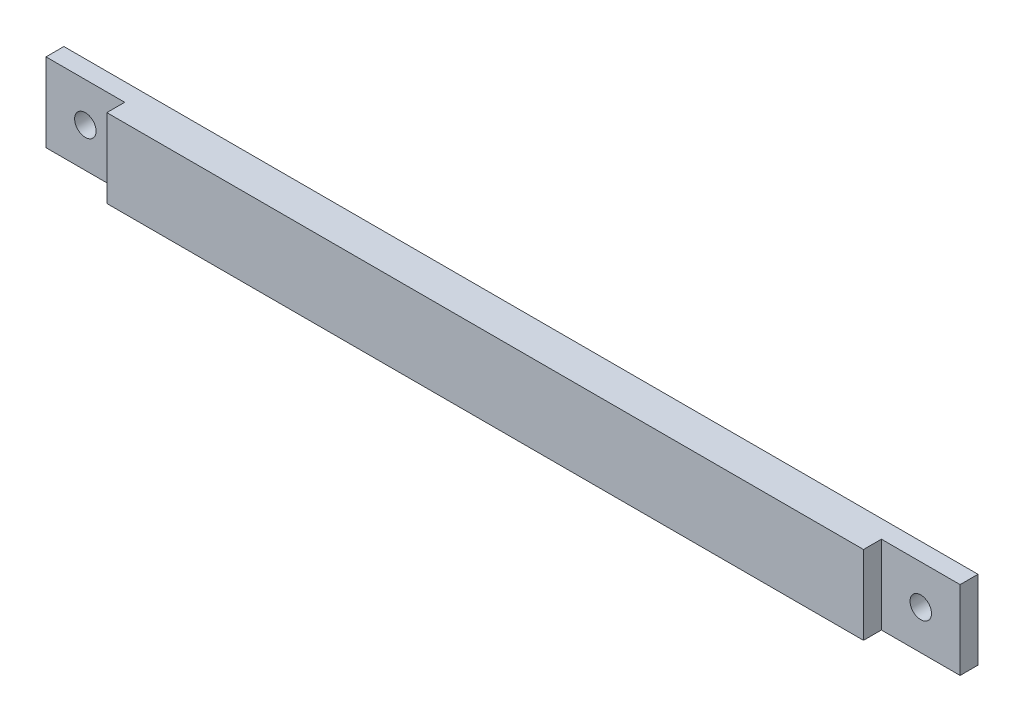
ISO-10303-21;
HEADER;
FILE_DESCRIPTION(('STEP AP214'),'2;1');
FILE_NAME('part.step','',(''),(''),'','','');
FILE_SCHEMA(('AUTOMOTIVE_DESIGN { 1 0 10303 214 1 1 1 1 }'));
ENDSEC;
DATA;
#1=APPLICATION_CONTEXT('core data for automotive mechanical design processes');
#2=APPLICATION_PROTOCOL_DEFINITION('international standard','automotive_design',2000,#1);
#3=PRODUCT_CONTEXT('',#1,'mechanical');
#4=PRODUCT('Part','Part','',(#3));
#5=PRODUCT_RELATED_PRODUCT_CATEGORY('part','',(#4));
#6=PRODUCT_DEFINITION_FORMATION('','',#4);
#7=PRODUCT_DEFINITION_CONTEXT('part definition',#1,'design');
#8=PRODUCT_DEFINITION('design','',#6,#7);
#9=PRODUCT_DEFINITION_SHAPE('','',#8);
#10=(LENGTH_UNIT() NAMED_UNIT(*) SI_UNIT(.MILLI.,.METRE.));
#11=(NAMED_UNIT(*) PLANE_ANGLE_UNIT() SI_UNIT($,.RADIAN.));
#12=(NAMED_UNIT(*) SI_UNIT($,.STERADIAN.) SOLID_ANGLE_UNIT());
#13=UNCERTAINTY_MEASURE_WITH_UNIT(LENGTH_MEASURE(1.E-05),#10,'distance_accuracy_value','');
#14=(GEOMETRIC_REPRESENTATION_CONTEXT(3) GLOBAL_UNCERTAINTY_ASSIGNED_CONTEXT((#13)) GLOBAL_UNIT_ASSIGNED_CONTEXT((#10,
#11,#12)) REPRESENTATION_CONTEXT('',''));
#15=CARTESIAN_POINT('',(0.,0.,0.));
#16=DIRECTION('',(0.,0.,1.));
#17=DIRECTION('',(1.,0.,0.));
#18=AXIS2_PLACEMENT_3D('',#15,#16,#17);
#19=CARTESIAN_POINT('',(-138.722028198163,53.8888888888889,10.));
#20=DIRECTION('',(1.,0.,0.));
#21=DIRECTION('',(0.,0.,-1.));
#22=AXIS2_PLACEMENT_3D('',#19,#20,#21);
#23=PLANE('',#22);
#24=DIRECTION('',(0.,-1.,0.));
#25=VECTOR('',#24,1.);
#26=CARTESIAN_POINT('',(-138.722028198163,53.8888888888889,5.));
#27=LINE('',#26,#25);
#28=CARTESIAN_POINT('',(-138.722028198163,53.8888888888889,5.));
#29=VERTEX_POINT('',#28);
#30=CARTESIAN_POINT('',(-138.722028198163,31.8888888888889,5.));
#31=VERTEX_POINT('',#30);
#32=EDGE_CURVE('E110',#29,#31,#27,.T.);
#33=ORIENTED_EDGE('',*,*,#32,.F.);
#34=DIRECTION('',(0.,0.,-1.));
#35=VECTOR('',#34,1.);
#36=CARTESIAN_POINT('',(-138.722028198163,53.8888888888889,10.));
#37=LINE('',#36,#35);
#38=CARTESIAN_POINT('',(-138.722028198163,53.8888888888889,0.));
#39=VERTEX_POINT('',#38);
#40=EDGE_CURVE('E134',#29,#39,#37,.T.);
#41=ORIENTED_EDGE('',*,*,#40,.T.);
#42=DIRECTION('',(0.,-1.,0.));
#43=VECTOR('',#42,1.);
#44=CARTESIAN_POINT('',(-138.722028198163,53.8888888888889,0.));
#45=LINE('',#44,#43);
#46=CARTESIAN_POINT('',(-138.722028198163,31.8888888888889,0.));
#47=VERTEX_POINT('',#46);
#48=EDGE_CURVE('E133',#39,#47,#45,.T.);
#49=ORIENTED_EDGE('',*,*,#48,.T.);
#50=DIRECTION('',(0.,0.,-1.));
#51=VECTOR('',#50,1.);
#52=CARTESIAN_POINT('',(-138.722028198163,31.8888888888889,10.));
#53=LINE('',#52,#51);
#54=EDGE_CURVE('E11',#31,#47,#53,.T.);
#55=ORIENTED_EDGE('',*,*,#54,.F.);
#56=EDGE_LOOP('',(#33,#41,#49,#55));
#57=FACE_BOUND('',#56,.T.);
#58=ADVANCED_FACE('F45',(#57),#23,.F.);
#59=CARTESIAN_POINT('',(-127.722028198163,42.8888888888889,10.));
#60=DIRECTION('',(0.,0.,-1.));
#61=DIRECTION('',(-1.,0.,0.));
#62=AXIS2_PLACEMENT_3D('',#59,#60,#61);
#63=CYLINDRICAL_SURFACE('',#62,3.00000000000001);
#64=CARTESIAN_POINT('',(-127.722028198163,42.8888888888889,0.));
#65=DIRECTION('',(0.,0.,1.));
#66=DIRECTION('',(1.,0.,0.));
#67=AXIS2_PLACEMENT_3D('',#64,#65,#66);
#68=CIRCLE('',#67,3.00000000000001);
#69=CARTESIAN_POINT('',(-124.722028198163,42.8888888888889,0.));
#70=VERTEX_POINT('',#69);
#71=EDGE_CURVE('E140',#70,#70,#68,.T.);
#72=ORIENTED_EDGE('',*,*,#71,.F.);
#73=EDGE_LOOP('',(#72));
#74=FACE_BOUND('',#73,.T.);
#75=CARTESIAN_POINT('',(-127.722028198163,42.8888888888889,5.));
#76=DIRECTION('',(0.,0.,1.));
#77=DIRECTION('',(1.,0.,0.));
#78=AXIS2_PLACEMENT_3D('',#75,#76,#77);
#79=CIRCLE('',#78,3.00000000000001);
#80=CARTESIAN_POINT('',(-124.722028198163,42.8888888888889,5.));
#81=VERTEX_POINT('',#80);
#82=EDGE_CURVE('E48',#81,#81,#79,.T.);
#83=ORIENTED_EDGE('',*,*,#82,.T.);
#84=EDGE_LOOP('',(#83));
#85=FACE_BOUND('',#84,.T.);
#86=ADVANCED_FACE('F236',(#74,#85),#63,.F.);
#87=CARTESIAN_POINT('',(0.,0.,10.));
#88=DIRECTION('',(0.,0.,1.));
#89=DIRECTION('',(1.,0.,0.));
#90=AXIS2_PLACEMENT_3D('',#87,#88,#89);
#91=PLANE('',#90);
#92=DIRECTION('',(0.,1.,0.));
#93=VECTOR('',#92,1.);
#94=CARTESIAN_POINT('',(-116.722028198163,53.8888888888889,10.));
#95=LINE('',#94,#93);
#96=CARTESIAN_POINT('',(-116.722028198163,31.8888888888889,10.));
#97=VERTEX_POINT('',#96);
#98=CARTESIAN_POINT('',(-116.722028198163,53.8888888888889,10.));
#99=VERTEX_POINT('',#98);
#100=EDGE_CURVE('E121',#97,#99,#95,.T.);
#101=ORIENTED_EDGE('',*,*,#100,.F.);
#102=DIRECTION('',(1.,0.,0.));
#103=VECTOR('',#102,1.);
#104=CARTESIAN_POINT('',(-138.722028198163,31.8888888888889,10.));
#105=LINE('',#104,#103);
#106=CARTESIAN_POINT('',(94.7679718018368,31.8888888888889,10.));
#107=VERTEX_POINT('',#106);
#108=EDGE_CURVE('E159',#97,#107,#105,.T.);
#109=ORIENTED_EDGE('',*,*,#108,.T.);
#110=DIRECTION('',(0.,-1.,0.));
#111=VECTOR('',#110,1.);
#112=CARTESIAN_POINT('',(94.7679718018368,53.8888888888889,10.));
#113=LINE('',#112,#111);
#114=CARTESIAN_POINT('',(94.7679718018368,53.8888888888889,10.));
#115=VERTEX_POINT('',#114);
#116=EDGE_CURVE('E193',#115,#107,#113,.T.);
#117=ORIENTED_EDGE('',*,*,#116,.F.);
#118=DIRECTION('',(-1.,0.,0.));
#119=VECTOR('',#118,1.);
#120=CARTESIAN_POINT('',(-138.722028198163,53.8888888888889,10.));
#121=LINE('',#120,#119);
#122=EDGE_CURVE('E150',#115,#99,#121,.T.);
#123=ORIENTED_EDGE('',*,*,#122,.T.);
#124=EDGE_LOOP('',(#101,#109,#117,#123));
#125=FACE_BOUND('',#124,.T.);
#126=ADVANCED_FACE('F215',(#125),#91,.T.);
#127=CARTESIAN_POINT('',(0.,0.,0.));
#128=DIRECTION('',(0.,0.,1.));
#129=DIRECTION('',(1.,0.,0.));
#130=AXIS2_PLACEMENT_3D('',#127,#128,#129);
#131=PLANE('',#130);
#132=ORIENTED_EDGE('',*,*,#48,.F.);
#133=DIRECTION('',(-1.,0.,0.));
#134=VECTOR('',#133,1.);
#135=CARTESIAN_POINT('',(-138.722028198163,53.8888888888889,0.));
#136=LINE('',#135,#134);
#137=CARTESIAN_POINT('',(116.767971801837,53.8888888888889,0.));
#138=VERTEX_POINT('',#137);
#139=EDGE_CURVE('E156',#138,#39,#136,.T.);
#140=ORIENTED_EDGE('',*,*,#139,.F.);
#141=DIRECTION('',(0.,1.,0.));
#142=VECTOR('',#141,1.);
#143=CARTESIAN_POINT('',(116.767971801837,53.8888888888889,0.));
#144=LINE('',#143,#142);
#145=CARTESIAN_POINT('',(116.767971801837,31.8888888888889,0.));
#146=VERTEX_POINT('',#145);
#147=EDGE_CURVE('E144',#146,#138,#144,.T.);
#148=ORIENTED_EDGE('',*,*,#147,.F.);
#149=DIRECTION('',(1.,0.,0.));
#150=VECTOR('',#149,1.);
#151=CARTESIAN_POINT('',(-138.722028198163,31.8888888888889,0.));
#152=LINE('',#151,#150);
#153=EDGE_CURVE('E139',#47,#146,#152,.T.);
#154=ORIENTED_EDGE('',*,*,#153,.F.);
#155=EDGE_LOOP('',(#132,#140,#148,#154));
#156=FACE_BOUND('',#155,.T.);
#157=ORIENTED_EDGE('',*,*,#71,.T.);
#158=EDGE_LOOP('',(#157));
#159=FACE_BOUND('',#158,.T.);
#160=CARTESIAN_POINT('',(105.767971801837,42.8888888888889,0.));
#161=DIRECTION('',(0.,0.,1.));
#162=DIRECTION('',(1.,0.,0.));
#163=AXIS2_PLACEMENT_3D('',#160,#161,#162);
#164=CIRCLE('',#163,3.00000000000001);
#165=CARTESIAN_POINT('',(108.767971801837,42.8888888888889,0.));
#166=VERTEX_POINT('',#165);
#167=EDGE_CURVE('E147',#166,#166,#164,.T.);
#168=ORIENTED_EDGE('',*,*,#167,.T.);
#169=EDGE_LOOP('',(#168));
#170=FACE_BOUND('',#169,.T.);
#171=ADVANCED_FACE('F246',(#156,#159,#170),#131,.F.);
#172=CARTESIAN_POINT('',(-138.722028198163,31.8888888888889,10.));
#173=DIRECTION('',(0.,1.,0.));
#174=DIRECTION('',(0.,0.,1.));
#175=AXIS2_PLACEMENT_3D('',#172,#173,#174);
#176=PLANE('',#175);
#177=ORIENTED_EDGE('',*,*,#108,.F.);
#178=DIRECTION('',(0.,0.,1.));
#179=VECTOR('',#178,1.);
#180=CARTESIAN_POINT('',(-116.722028198163,31.8888888888889,5.));
#181=LINE('',#180,#179);
#182=CARTESIAN_POINT('',(-116.722028198163,31.8888888888889,5.));
#183=VERTEX_POINT('',#182);
#184=EDGE_CURVE('E128',#183,#97,#181,.T.);
#185=ORIENTED_EDGE('',*,*,#184,.F.);
#186=DIRECTION('',(1.,0.,0.));
#187=VECTOR('',#186,1.);
#188=CARTESIAN_POINT('',(-138.722028198163,31.8888888888889,5.));
#189=LINE('',#188,#187);
#190=EDGE_CURVE('E113',#31,#183,#189,.T.);
#191=ORIENTED_EDGE('',*,*,#190,.F.);
#192=ORIENTED_EDGE('',*,*,#54,.T.);
#193=ORIENTED_EDGE('',*,*,#153,.T.);
#194=DIRECTION('',(0.,0.,-1.));
#195=VECTOR('',#194,1.);
#196=CARTESIAN_POINT('',(116.767971801837,31.8888888888889,10.));
#197=LINE('',#196,#195);
#198=CARTESIAN_POINT('',(116.767971801837,31.8888888888889,5.));
#199=VERTEX_POINT('',#198);
#200=EDGE_CURVE('E54',#199,#146,#197,.T.);
#201=ORIENTED_EDGE('',*,*,#200,.F.);
#202=DIRECTION('',(1.,0.,0.));
#203=VECTOR('',#202,1.);
#204=CARTESIAN_POINT('',(116.767971801837,31.8888888888889,5.));
#205=LINE('',#204,#203);
#206=CARTESIAN_POINT('',(94.7679718018368,31.8888888888889,5.));
#207=VERTEX_POINT('',#206);
#208=EDGE_CURVE('E188',#207,#199,#205,.T.);
#209=ORIENTED_EDGE('',*,*,#208,.F.);
#210=DIRECTION('',(0.,0.,1.));
#211=VECTOR('',#210,1.);
#212=CARTESIAN_POINT('',(94.7679718018368,31.8888888888889,5.));
#213=LINE('',#212,#211);
#214=EDGE_CURVE('E189',#207,#107,#213,.T.);
#215=ORIENTED_EDGE('',*,*,#214,.T.);
#216=EDGE_LOOP('',(#177,#185,#191,#192,#193,#201,#209,#215));
#217=FACE_BOUND('',#216,.T.);
#218=ADVANCED_FACE('F125',(#217),#176,.F.);
#219=CARTESIAN_POINT('',(116.767971801837,53.8888888888889,10.));
#220=DIRECTION('',(-1.,0.,0.));
#221=DIRECTION('',(0.,0.,1.));
#222=AXIS2_PLACEMENT_3D('',#219,#220,#221);
#223=PLANE('',#222);
#224=DIRECTION('',(0.,0.,-1.));
#225=VECTOR('',#224,1.);
#226=CARTESIAN_POINT('',(116.767971801837,53.8888888888889,10.));
#227=LINE('',#226,#225);
#228=CARTESIAN_POINT('',(116.767971801837,53.8888888888889,5.));
#229=VERTEX_POINT('',#228);
#230=EDGE_CURVE('E162',#229,#138,#227,.T.);
#231=ORIENTED_EDGE('',*,*,#230,.F.);
#232=DIRECTION('',(0.,1.,0.));
#233=VECTOR('',#232,1.);
#234=CARTESIAN_POINT('',(116.767971801837,53.8888888888889,5.));
#235=LINE('',#234,#233);
#236=EDGE_CURVE('E70',#199,#229,#235,.T.);
#237=ORIENTED_EDGE('',*,*,#236,.F.);
#238=ORIENTED_EDGE('',*,*,#200,.T.);
#239=ORIENTED_EDGE('',*,*,#147,.T.);
#240=EDGE_LOOP('',(#231,#237,#238,#239));
#241=FACE_BOUND('',#240,.T.);
#242=ADVANCED_FACE('F254',(#241),#223,.F.);
#243=CARTESIAN_POINT('',(-138.722028198163,53.8888888888889,10.));
#244=DIRECTION('',(0.,-1.,0.));
#245=DIRECTION('',(0.,0.,-1.));
#246=AXIS2_PLACEMENT_3D('',#243,#244,#245);
#247=PLANE('',#246);
#248=DIRECTION('',(-1.,0.,0.));
#249=VECTOR('',#248,1.);
#250=CARTESIAN_POINT('',(-138.722028198163,53.8888888888889,5.));
#251=LINE('',#250,#249);
#252=CARTESIAN_POINT('',(-116.722028198163,53.8888888888889,5.));
#253=VERTEX_POINT('',#252);
#254=EDGE_CURVE('E116',#253,#29,#251,.T.);
#255=ORIENTED_EDGE('',*,*,#254,.F.);
#256=DIRECTION('',(0.,0.,1.));
#257=VECTOR('',#256,1.);
#258=CARTESIAN_POINT('',(-116.722028198163,53.8888888888889,5.));
#259=LINE('',#258,#257);
#260=EDGE_CURVE('E169',#253,#99,#259,.T.);
#261=ORIENTED_EDGE('',*,*,#260,.T.);
#262=ORIENTED_EDGE('',*,*,#122,.F.);
#263=DIRECTION('',(0.,0.,1.));
#264=VECTOR('',#263,1.);
#265=CARTESIAN_POINT('',(94.7679718018368,53.8888888888889,5.));
#266=LINE('',#265,#264);
#267=CARTESIAN_POINT('',(94.7679718018368,53.8888888888889,5.));
#268=VERTEX_POINT('',#267);
#269=EDGE_CURVE('E185',#268,#115,#266,.T.);
#270=ORIENTED_EDGE('',*,*,#269,.F.);
#271=DIRECTION('',(-1.,0.,0.));
#272=VECTOR('',#271,1.);
#273=CARTESIAN_POINT('',(116.767971801837,53.8888888888889,5.));
#274=LINE('',#273,#272);
#275=EDGE_CURVE('E202',#229,#268,#274,.T.);
#276=ORIENTED_EDGE('',*,*,#275,.F.);
#277=ORIENTED_EDGE('',*,*,#230,.T.);
#278=ORIENTED_EDGE('',*,*,#139,.T.);
#279=ORIENTED_EDGE('',*,*,#40,.F.);
#280=EDGE_LOOP('',(#255,#261,#262,#270,#276,#277,#278,#279));
#281=FACE_BOUND('',#280,.T.);
#282=ADVANCED_FACE('F217',(#281),#247,.F.);
#283=CARTESIAN_POINT('',(105.767971801837,42.8888888888889,10.));
#284=DIRECTION('',(0.,0.,-1.));
#285=DIRECTION('',(-1.,0.,0.));
#286=AXIS2_PLACEMENT_3D('',#283,#284,#285);
#287=CYLINDRICAL_SURFACE('',#286,3.00000000000001);
#288=CARTESIAN_POINT('',(105.767971801837,42.8888888888889,5.));
#289=DIRECTION('',(0.,0.,-1.));
#290=DIRECTION('',(-1.,0.,0.));
#291=AXIS2_PLACEMENT_3D('',#288,#289,#290);
#292=CIRCLE('',#291,3.00000000000001);
#293=CARTESIAN_POINT('',(102.767971801837,42.8888888888889,5.));
#294=VERTEX_POINT('',#293);
#295=EDGE_CURVE('E166',#294,#294,#292,.T.);
#296=ORIENTED_EDGE('',*,*,#295,.F.);
#297=EDGE_LOOP('',(#296));
#298=FACE_BOUND('',#297,.T.);
#299=ORIENTED_EDGE('',*,*,#167,.F.);
#300=EDGE_LOOP('',(#299));
#301=FACE_BOUND('',#300,.T.);
#302=ADVANCED_FACE('F232',(#298,#301),#287,.F.);
#303=CARTESIAN_POINT('',(94.7679718018368,53.8888888888889,5.));
#304=DIRECTION('',(-1.,0.,0.));
#305=DIRECTION('',(0.,0.,1.));
#306=AXIS2_PLACEMENT_3D('',#303,#304,#305);
#307=PLANE('',#306);
#308=ORIENTED_EDGE('',*,*,#116,.T.);
#309=ORIENTED_EDGE('',*,*,#214,.F.);
#310=DIRECTION('',(0.,-1.,0.));
#311=VECTOR('',#310,1.);
#312=CARTESIAN_POINT('',(94.7679718018368,53.8888888888889,5.));
#313=LINE('',#312,#311);
#314=EDGE_CURVE('E198',#268,#207,#313,.T.);
#315=ORIENTED_EDGE('',*,*,#314,.F.);
#316=ORIENTED_EDGE('',*,*,#269,.T.);
#317=EDGE_LOOP('',(#308,#309,#315,#316));
#318=FACE_BOUND('',#317,.T.);
#319=ADVANCED_FACE('F220',(#318),#307,.F.);
#320=CARTESIAN_POINT('',(0.,0.,5.));
#321=DIRECTION('',(0.,0.,-1.));
#322=DIRECTION('',(-1.,0.,0.));
#323=AXIS2_PLACEMENT_3D('',#320,#321,#322);
#324=PLANE('',#323);
#325=ORIENTED_EDGE('',*,*,#295,.T.);
#326=EDGE_LOOP('',(#325));
#327=FACE_BOUND('',#326,.T.);
#328=ORIENTED_EDGE('',*,*,#236,.T.);
#329=ORIENTED_EDGE('',*,*,#275,.T.);
#330=ORIENTED_EDGE('',*,*,#314,.T.);
#331=ORIENTED_EDGE('',*,*,#208,.T.);
#332=EDGE_LOOP('',(#328,#329,#330,#331));
#333=FACE_BOUND('',#332,.T.);
#334=ADVANCED_FACE('F222',(#327,#333),#324,.F.);
#335=CARTESIAN_POINT('',(-116.722028198163,53.8888888888889,5.));
#336=DIRECTION('',(1.,0.,0.));
#337=DIRECTION('',(0.,0.,-1.));
#338=AXIS2_PLACEMENT_3D('',#335,#336,#337);
#339=PLANE('',#338);
#340=ORIENTED_EDGE('',*,*,#100,.T.);
#341=ORIENTED_EDGE('',*,*,#260,.F.);
#342=DIRECTION('',(0.,1.,0.));
#343=VECTOR('',#342,1.);
#344=CARTESIAN_POINT('',(-116.722028198163,53.8888888888889,5.));
#345=LINE('',#344,#343);
#346=EDGE_CURVE('E62',#183,#253,#345,.T.);
#347=ORIENTED_EDGE('',*,*,#346,.F.);
#348=ORIENTED_EDGE('',*,*,#184,.T.);
#349=EDGE_LOOP('',(#340,#341,#347,#348));
#350=FACE_BOUND('',#349,.T.);
#351=ADVANCED_FACE('F224',(#350),#339,.F.);
#352=CARTESIAN_POINT('',(0.,0.,5.));
#353=DIRECTION('',(0.,0.,1.));
#354=DIRECTION('',(1.,0.,0.));
#355=AXIS2_PLACEMENT_3D('',#352,#353,#354);
#356=PLANE('',#355);
#357=ORIENTED_EDGE('',*,*,#82,.F.);
#358=EDGE_LOOP('',(#357));
#359=FACE_BOUND('',#358,.T.);
#360=ORIENTED_EDGE('',*,*,#32,.T.);
#361=ORIENTED_EDGE('',*,*,#190,.T.);
#362=ORIENTED_EDGE('',*,*,#346,.T.);
#363=ORIENTED_EDGE('',*,*,#254,.T.);
#364=EDGE_LOOP('',(#360,#361,#362,#363));
#365=FACE_BOUND('',#364,.T.);
#366=ADVANCED_FACE('F112',(#359,#365),#356,.T.);
#367=CLOSED_SHELL('',(#58,#86,#126,#171,#218,#242,#282,#302,#319,#334,#351,#366));
#368=MANIFOLD_SOLID_BREP('B2',#367);
#369=ADVANCED_BREP_SHAPE_REPRESENTATION('',(#18,#368),#14);
#370=SHAPE_DEFINITION_REPRESENTATION(#9,#369);
ENDSEC;
END-ISO-10303-21;
